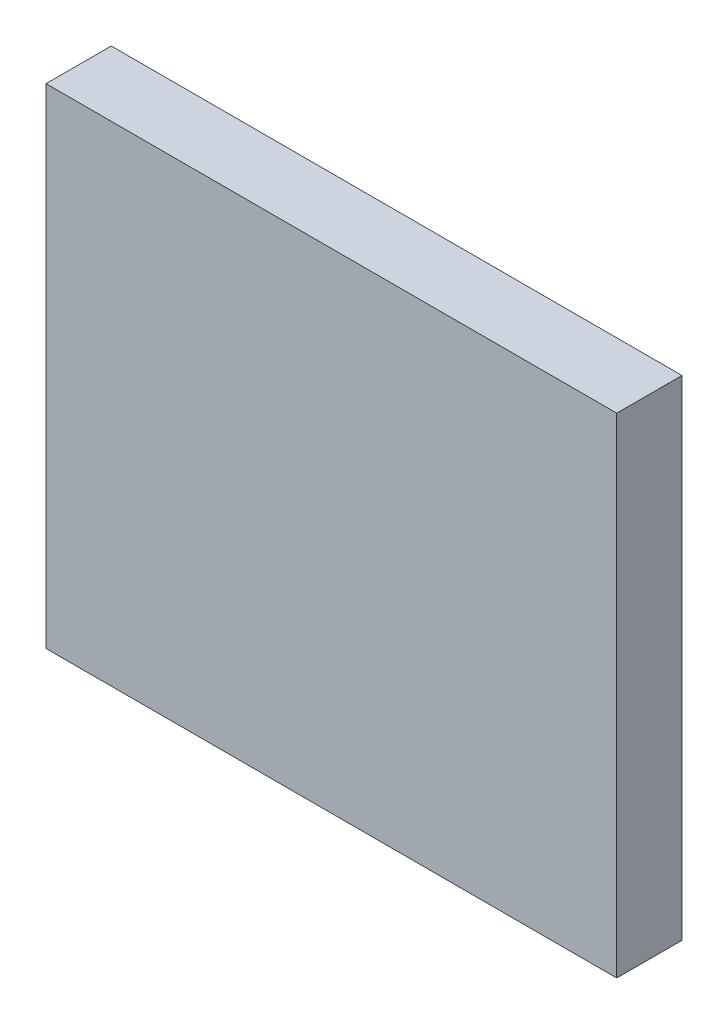
ISO-10303-21;
HEADER;
FILE_DESCRIPTION(('STEP AP214'),'2;1');
FILE_NAME('part.step','',(''),(''),'','','');
FILE_SCHEMA(('AUTOMOTIVE_DESIGN { 1 0 10303 214 1 1 1 1 }'));
ENDSEC;
DATA;
#1=APPLICATION_CONTEXT('core data for automotive mechanical design processes');
#2=APPLICATION_PROTOCOL_DEFINITION('international standard','automotive_design',2000,#1);
#3=PRODUCT_CONTEXT('',#1,'mechanical');
#4=PRODUCT('Part','Part','',(#3));
#5=PRODUCT_RELATED_PRODUCT_CATEGORY('part','',(#4));
#6=PRODUCT_DEFINITION_FORMATION('','',#4);
#7=PRODUCT_DEFINITION_CONTEXT('part definition',#1,'design');
#8=PRODUCT_DEFINITION('design','',#6,#7);
#9=PRODUCT_DEFINITION_SHAPE('','',#8);
#10=(LENGTH_UNIT() NAMED_UNIT(*) SI_UNIT(.MILLI.,.METRE.));
#11=(NAMED_UNIT(*) PLANE_ANGLE_UNIT() SI_UNIT($,.RADIAN.));
#12=(NAMED_UNIT(*) SI_UNIT($,.STERADIAN.) SOLID_ANGLE_UNIT());
#13=UNCERTAINTY_MEASURE_WITH_UNIT(LENGTH_MEASURE(1.E-05),#10,'distance_accuracy_value','');
#14=(GEOMETRIC_REPRESENTATION_CONTEXT(3) GLOBAL_UNCERTAINTY_ASSIGNED_CONTEXT((#13)) GLOBAL_UNIT_ASSIGNED_CONTEXT((#10,
#11,#12)) REPRESENTATION_CONTEXT('',''));
#15=CARTESIAN_POINT('',(0.,0.,0.));
#16=DIRECTION('',(0.,0.,1.));
#17=DIRECTION('',(1.,0.,0.));
#18=AXIS2_PLACEMENT_3D('',#15,#16,#17);
#19=CARTESIAN_POINT('',(0.,0.,4.));
#20=DIRECTION('',(1.,0.,0.));
#21=DIRECTION('',(0.,0.,-1.));
#22=AXIS2_PLACEMENT_3D('',#19,#20,#21);
#23=PLANE('',#22);
#24=DIRECTION('',(0.,-1.,0.));
#25=VECTOR('',#24,1.);
#26=CARTESIAN_POINT('',(0.,0.,0.));
#27=LINE('',#26,#25);
#28=CARTESIAN_POINT('',(0.,30.,0.));
#29=VERTEX_POINT('',#28);
#30=CARTESIAN_POINT('',(0.,0.,0.));
#31=VERTEX_POINT('',#30);
#32=EDGE_CURVE('E113',#29,#31,#27,.T.);
#33=ORIENTED_EDGE('',*,*,#32,.T.);
#34=DIRECTION('',(0.,0.,-1.));
#35=VECTOR('',#34,1.);
#36=CARTESIAN_POINT('',(0.,0.,4.));
#37=LINE('',#36,#35);
#38=CARTESIAN_POINT('',(0.,0.,4.));
#39=VERTEX_POINT('',#38);
#40=EDGE_CURVE('E11',#39,#31,#37,.T.);
#41=ORIENTED_EDGE('',*,*,#40,.F.);
#42=DIRECTION('',(0.,-1.,0.));
#43=VECTOR('',#42,1.);
#44=CARTESIAN_POINT('',(0.,0.,4.));
#45=LINE('',#44,#43);
#46=CARTESIAN_POINT('',(0.,30.,4.));
#47=VERTEX_POINT('',#46);
#48=EDGE_CURVE('E97',#47,#39,#45,.T.);
#49=ORIENTED_EDGE('',*,*,#48,.F.);
#50=DIRECTION('',(0.,0.,-1.));
#51=VECTOR('',#50,1.);
#52=CARTESIAN_POINT('',(0.,30.,4.));
#53=LINE('',#52,#51);
#54=EDGE_CURVE('E109',#47,#29,#53,.T.);
#55=ORIENTED_EDGE('',*,*,#54,.T.);
#56=EDGE_LOOP('',(#33,#41,#49,#55));
#57=FACE_BOUND('',#56,.T.);
#58=ADVANCED_FACE('F45',(#57),#23,.F.);
#59=CARTESIAN_POINT('',(0.,0.,4.));
#60=DIRECTION('',(0.,1.,0.));
#61=DIRECTION('',(0.,0.,1.));
#62=AXIS2_PLACEMENT_3D('',#59,#60,#61);
#63=PLANE('',#62);
#64=DIRECTION('',(1.,0.,0.));
#65=VECTOR('',#64,1.);
#66=CARTESIAN_POINT('',(0.,0.,0.));
#67=LINE('',#66,#65);
#68=CARTESIAN_POINT('',(35.,0.,0.));
#69=VERTEX_POINT('',#68);
#70=EDGE_CURVE('E102',#31,#69,#67,.T.);
#71=ORIENTED_EDGE('',*,*,#70,.T.);
#72=DIRECTION('',(0.,0.,-1.));
#73=VECTOR('',#72,1.);
#74=CARTESIAN_POINT('',(35.,0.,4.));
#75=LINE('',#74,#73);
#76=CARTESIAN_POINT('',(35.,0.,4.));
#77=VERTEX_POINT('',#76);
#78=EDGE_CURVE('E54',#77,#69,#75,.T.);
#79=ORIENTED_EDGE('',*,*,#78,.F.);
#80=DIRECTION('',(1.,0.,0.));
#81=VECTOR('',#80,1.);
#82=CARTESIAN_POINT('',(0.,0.,4.));
#83=LINE('',#82,#81);
#84=EDGE_CURVE('E92',#39,#77,#83,.T.);
#85=ORIENTED_EDGE('',*,*,#84,.F.);
#86=ORIENTED_EDGE('',*,*,#40,.T.);
#87=EDGE_LOOP('',(#71,#79,#85,#86));
#88=FACE_BOUND('',#87,.T.);
#89=ADVANCED_FACE('F101',(#88),#63,.F.);
#90=CARTESIAN_POINT('',(35.,0.,4.));
#91=DIRECTION('',(-1.,0.,0.));
#92=DIRECTION('',(0.,0.,1.));
#93=AXIS2_PLACEMENT_3D('',#90,#91,#92);
#94=PLANE('',#93);
#95=DIRECTION('',(0.,1.,0.));
#96=VECTOR('',#95,1.);
#97=CARTESIAN_POINT('',(35.,0.,0.));
#98=LINE('',#97,#96);
#99=CARTESIAN_POINT('',(35.,30.,0.));
#100=VERTEX_POINT('',#99);
#101=EDGE_CURVE('E79',#69,#100,#98,.T.);
#102=ORIENTED_EDGE('',*,*,#101,.T.);
#103=DIRECTION('',(0.,0.,-1.));
#104=VECTOR('',#103,1.);
#105=CARTESIAN_POINT('',(35.,30.,4.));
#106=LINE('',#105,#104);
#107=CARTESIAN_POINT('',(35.,30.,4.));
#108=VERTEX_POINT('',#107);
#109=EDGE_CURVE('E104',#108,#100,#106,.T.);
#110=ORIENTED_EDGE('',*,*,#109,.F.);
#111=DIRECTION('',(0.,1.,0.));
#112=VECTOR('',#111,1.);
#113=CARTESIAN_POINT('',(35.,0.,4.));
#114=LINE('',#113,#112);
#115=EDGE_CURVE('E95',#77,#108,#114,.T.);
#116=ORIENTED_EDGE('',*,*,#115,.F.);
#117=ORIENTED_EDGE('',*,*,#78,.T.);
#118=EDGE_LOOP('',(#102,#110,#116,#117));
#119=FACE_BOUND('',#118,.T.);
#120=ADVANCED_FACE('F105',(#119),#94,.F.);
#121=CARTESIAN_POINT('',(0.,30.,4.));
#122=DIRECTION('',(0.,-1.,0.));
#123=DIRECTION('',(0.,0.,-1.));
#124=AXIS2_PLACEMENT_3D('',#121,#122,#123);
#125=PLANE('',#124);
#126=DIRECTION('',(-1.,0.,0.));
#127=VECTOR('',#126,1.);
#128=CARTESIAN_POINT('',(0.,30.,0.));
#129=LINE('',#128,#127);
#130=EDGE_CURVE('E85',#100,#29,#129,.T.);
#131=ORIENTED_EDGE('',*,*,#130,.T.);
#132=ORIENTED_EDGE('',*,*,#54,.F.);
#133=DIRECTION('',(-1.,0.,0.));
#134=VECTOR('',#133,1.);
#135=CARTESIAN_POINT('',(0.,30.,4.));
#136=LINE('',#135,#134);
#137=EDGE_CURVE('E62',#108,#47,#136,.T.);
#138=ORIENTED_EDGE('',*,*,#137,.F.);
#139=ORIENTED_EDGE('',*,*,#109,.T.);
#140=EDGE_LOOP('',(#131,#132,#138,#139));
#141=FACE_BOUND('',#140,.T.);
#142=ADVANCED_FACE('F126',(#141),#125,.F.);
#143=CARTESIAN_POINT('',(0.,0.,4.));
#144=DIRECTION('',(0.,0.,-1.));
#145=DIRECTION('',(-1.,0.,0.));
#146=AXIS2_PLACEMENT_3D('',#143,#144,#145);
#147=PLANE('',#146);
#148=ORIENTED_EDGE('',*,*,#48,.T.);
#149=ORIENTED_EDGE('',*,*,#84,.T.);
#150=ORIENTED_EDGE('',*,*,#115,.T.);
#151=ORIENTED_EDGE('',*,*,#137,.T.);
#152=EDGE_LOOP('',(#148,#149,#150,#151));
#153=FACE_BOUND('',#152,.T.);
#154=ADVANCED_FACE('F93',(#153),#147,.F.);
#155=CARTESIAN_POINT('',(0.,0.,0.));
#156=DIRECTION('',(0.,0.,-1.));
#157=DIRECTION('',(-1.,0.,0.));
#158=AXIS2_PLACEMENT_3D('',#155,#156,#157);
#159=PLANE('',#158);
#160=ORIENTED_EDGE('',*,*,#32,.F.);
#161=ORIENTED_EDGE('',*,*,#130,.F.);
#162=ORIENTED_EDGE('',*,*,#101,.F.);
#163=ORIENTED_EDGE('',*,*,#70,.F.);
#164=EDGE_LOOP('',(#160,#161,#162,#163));
#165=FACE_BOUND('',#164,.T.);
#166=ADVANCED_FACE('F129',(#165),#159,.T.);
#167=CLOSED_SHELL('',(#58,#89,#120,#142,#154,#166));
#168=MANIFOLD_SOLID_BREP('B2',#167);
#169=ADVANCED_BREP_SHAPE_REPRESENTATION('',(#18,#168),#14);
#170=SHAPE_DEFINITION_REPRESENTATION(#9,#169);
ENDSEC;
END-ISO-10303-21;
